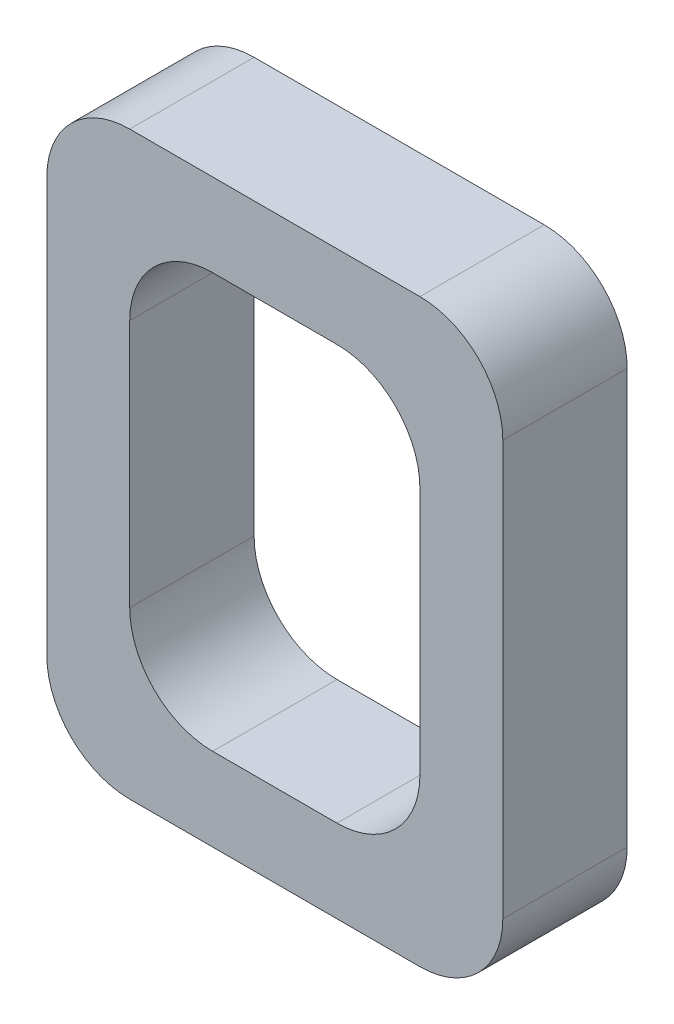
ISO-10303-21;
HEADER;
FILE_DESCRIPTION(('STEP AP214'),'2;1');
FILE_NAME('part.step','',(''),(''),'','','');
FILE_SCHEMA(('AUTOMOTIVE_DESIGN { 1 0 10303 214 1 1 1 1 }'));
ENDSEC;
DATA;
#1=APPLICATION_CONTEXT('core data for automotive mechanical design processes');
#2=APPLICATION_PROTOCOL_DEFINITION('international standard','automotive_design',2000,#1);
#3=PRODUCT_CONTEXT('',#1,'mechanical');
#4=PRODUCT('Part','Part','',(#3));
#5=PRODUCT_RELATED_PRODUCT_CATEGORY('part','',(#4));
#6=PRODUCT_DEFINITION_FORMATION('','',#4);
#7=PRODUCT_DEFINITION_CONTEXT('part definition',#1,'design');
#8=PRODUCT_DEFINITION('design','',#6,#7);
#9=PRODUCT_DEFINITION_SHAPE('','',#8);
#10=(LENGTH_UNIT() NAMED_UNIT(*) SI_UNIT(.MILLI.,.METRE.));
#11=(NAMED_UNIT(*) PLANE_ANGLE_UNIT() SI_UNIT($,.RADIAN.));
#12=(NAMED_UNIT(*) SI_UNIT($,.STERADIAN.) SOLID_ANGLE_UNIT());
#13=UNCERTAINTY_MEASURE_WITH_UNIT(LENGTH_MEASURE(1.E-05),#10,'distance_accuracy_value','');
#14=(GEOMETRIC_REPRESENTATION_CONTEXT(3) GLOBAL_UNCERTAINTY_ASSIGNED_CONTEXT((#13)) GLOBAL_UNIT_ASSIGNED_CONTEXT((#10,
#11,#12)) REPRESENTATION_CONTEXT('',''));
#15=CARTESIAN_POINT('',(0.,0.,0.));
#16=DIRECTION('',(0.,0.,1.));
#17=DIRECTION('',(1.,0.,0.));
#18=AXIS2_PLACEMENT_3D('',#15,#16,#17);
#19=CARTESIAN_POINT('',(-17.5,25.,15.));
#20=DIRECTION('',(0.,0.,1.));
#21=DIRECTION('',(1.,0.,0.));
#22=AXIS2_PLACEMENT_3D('',#19,#20,#21);
#23=PLANE('',#22);
#24=CARTESIAN_POINT('',(-17.5,25.,15.));
#25=DIRECTION('',(0.,0.,1.));
#26=DIRECTION('',(1.,0.,0.));
#27=AXIS2_PLACEMENT_3D('',#24,#25,#26);
#28=CIRCLE('',#27,10.);
#29=CARTESIAN_POINT('',(-17.4999999999999,35.,15.));
#30=VERTEX_POINT('',#29);
#31=CARTESIAN_POINT('',(-27.5,24.9999999999999,15.));
#32=VERTEX_POINT('',#31);
#33=EDGE_CURVE('E210',#30,#32,#28,.T.);
#34=ORIENTED_EDGE('',*,*,#33,.T.);
#35=DIRECTION('',(0.,-1.,0.));
#36=VECTOR('',#35,1.);
#37=CARTESIAN_POINT('',(-27.5,-24.9999999999999,15.));
#38=LINE('',#37,#36);
#39=CARTESIAN_POINT('',(-27.5,-24.9999999999999,15.));
#40=VERTEX_POINT('',#39);
#41=EDGE_CURVE('E213',#32,#40,#38,.T.);
#42=ORIENTED_EDGE('',*,*,#41,.T.);
#43=CARTESIAN_POINT('',(-17.5,-25.,15.));
#44=DIRECTION('',(0.,0.,1.));
#45=DIRECTION('',(-1.,0.,0.));
#46=AXIS2_PLACEMENT_3D('',#43,#44,#45);
#47=CIRCLE('',#46,10.);
#48=CARTESIAN_POINT('',(-17.4999999999999,-35.,15.));
#49=VERTEX_POINT('',#48);
#50=EDGE_CURVE('E216',#40,#49,#47,.T.);
#51=ORIENTED_EDGE('',*,*,#50,.T.);
#52=DIRECTION('',(1.,0.,0.));
#53=VECTOR('',#52,1.);
#54=CARTESIAN_POINT('',(-17.4999999999999,-35.,15.));
#55=LINE('',#54,#53);
#56=CARTESIAN_POINT('',(17.4999999999999,-35.,15.));
#57=VERTEX_POINT('',#56);
#58=EDGE_CURVE('E218',#49,#57,#55,.T.);
#59=ORIENTED_EDGE('',*,*,#58,.T.);
#60=CARTESIAN_POINT('',(17.5,-25.,15.));
#61=DIRECTION('',(0.,0.,1.));
#62=DIRECTION('',(1.,0.,0.));
#63=AXIS2_PLACEMENT_3D('',#60,#61,#62);
#64=CIRCLE('',#63,10.);
#65=CARTESIAN_POINT('',(27.5,-24.9999999999999,15.));
#66=VERTEX_POINT('',#65);
#67=EDGE_CURVE('E220',#57,#66,#64,.T.);
#68=ORIENTED_EDGE('',*,*,#67,.T.);
#69=DIRECTION('',(0.,1.,0.));
#70=VECTOR('',#69,1.);
#71=CARTESIAN_POINT('',(27.5,-24.9999999999999,15.));
#72=LINE('',#71,#70);
#73=CARTESIAN_POINT('',(27.5,24.9999999999999,15.));
#74=VERTEX_POINT('',#73);
#75=EDGE_CURVE('E222',#66,#74,#72,.T.);
#76=ORIENTED_EDGE('',*,*,#75,.T.);
#77=CARTESIAN_POINT('',(17.5,25.,15.));
#78=DIRECTION('',(0.,0.,1.));
#79=DIRECTION('',(1.,0.,0.));
#80=AXIS2_PLACEMENT_3D('',#77,#78,#79);
#81=CIRCLE('',#80,10.);
#82=CARTESIAN_POINT('',(17.4999999999999,35.,15.));
#83=VERTEX_POINT('',#82);
#84=EDGE_CURVE('E224',#74,#83,#81,.T.);
#85=ORIENTED_EDGE('',*,*,#84,.T.);
#86=DIRECTION('',(-1.,0.,0.));
#87=VECTOR('',#86,1.);
#88=CARTESIAN_POINT('',(-17.4999999999999,35.,15.));
#89=LINE('',#88,#87);
#90=EDGE_CURVE('E226',#83,#30,#89,.T.);
#91=ORIENTED_EDGE('',*,*,#90,.T.);
#92=EDGE_LOOP('',(#34,#42,#51,#59,#68,#76,#85,#91));
#93=FACE_BOUND('',#92,.T.);
#94=DIRECTION('',(-1.,0.,0.));
#95=VECTOR('',#94,1.);
#96=CARTESIAN_POINT('',(-7.49999999999994,25.,15.));
#97=LINE('',#96,#95);
#98=CARTESIAN_POINT('',(7.49999999999993,25.,15.));
#99=VERTEX_POINT('',#98);
#100=CARTESIAN_POINT('',(-7.49999999999994,25.,15.));
#101=VERTEX_POINT('',#100);
#102=EDGE_CURVE('E153',#99,#101,#97,.T.);
#103=ORIENTED_EDGE('',*,*,#102,.F.);
#104=CARTESIAN_POINT('',(7.5,15.,15.));
#105=DIRECTION('',(0.,0.,1.));
#106=DIRECTION('',(-1.,0.,0.));
#107=AXIS2_PLACEMENT_3D('',#104,#105,#106);
#108=CIRCLE('',#107,10.);
#109=CARTESIAN_POINT('',(17.5,14.9999999999999,15.));
#110=VERTEX_POINT('',#109);
#111=EDGE_CURVE('E145',#110,#99,#108,.T.);
#112=ORIENTED_EDGE('',*,*,#111,.F.);
#113=DIRECTION('',(0.,1.,0.));
#114=VECTOR('',#113,1.);
#115=CARTESIAN_POINT('',(17.5,-14.9999999999999,15.));
#116=LINE('',#115,#114);
#117=CARTESIAN_POINT('',(17.5,-14.9999999999999,15.));
#118=VERTEX_POINT('',#117);
#119=EDGE_CURVE('E178',#118,#110,#116,.T.);
#120=ORIENTED_EDGE('',*,*,#119,.F.);
#121=CARTESIAN_POINT('',(7.5,-15.,15.));
#122=DIRECTION('',(0.,0.,1.));
#123=DIRECTION('',(-1.,0.,0.));
#124=AXIS2_PLACEMENT_3D('',#121,#122,#123);
#125=CIRCLE('',#124,10.);
#126=CARTESIAN_POINT('',(7.49999999999993,-25.,15.));
#127=VERTEX_POINT('',#126);
#128=EDGE_CURVE('E176',#127,#118,#125,.T.);
#129=ORIENTED_EDGE('',*,*,#128,.F.);
#130=DIRECTION('',(1.,0.,0.));
#131=VECTOR('',#130,1.);
#132=CARTESIAN_POINT('',(-7.49999999999994,-25.,15.));
#133=LINE('',#132,#131);
#134=CARTESIAN_POINT('',(-7.49999999999994,-25.,15.));
#135=VERTEX_POINT('',#134);
#136=EDGE_CURVE('E174',#135,#127,#133,.T.);
#137=ORIENTED_EDGE('',*,*,#136,.F.);
#138=CARTESIAN_POINT('',(-7.50000000000001,-15.,15.));
#139=DIRECTION('',(0.,0.,1.));
#140=DIRECTION('',(1.,0.,0.));
#141=AXIS2_PLACEMENT_3D('',#138,#139,#140);
#142=CIRCLE('',#141,10.);
#143=CARTESIAN_POINT('',(-17.5,-14.9999999999999,15.));
#144=VERTEX_POINT('',#143);
#145=EDGE_CURVE('E172',#144,#135,#142,.T.);
#146=ORIENTED_EDGE('',*,*,#145,.F.);
#147=DIRECTION('',(0.,-1.,0.));
#148=VECTOR('',#147,1.);
#149=CARTESIAN_POINT('',(-17.5,-14.9999999999999,15.));
#150=LINE('',#149,#148);
#151=CARTESIAN_POINT('',(-17.5,14.9999999999999,15.));
#152=VERTEX_POINT('',#151);
#153=EDGE_CURVE('E168',#152,#144,#150,.T.);
#154=ORIENTED_EDGE('',*,*,#153,.F.);
#155=CARTESIAN_POINT('',(-7.50000000000001,15.,15.));
#156=DIRECTION('',(0.,0.,1.));
#157=DIRECTION('',(-1.,0.,0.));
#158=AXIS2_PLACEMENT_3D('',#155,#156,#157);
#159=CIRCLE('',#158,10.);
#160=EDGE_CURVE('E166',#101,#152,#159,.T.);
#161=ORIENTED_EDGE('',*,*,#160,.F.);
#162=EDGE_LOOP('',(#103,#112,#120,#129,#137,#146,#154,#161));
#163=FACE_BOUND('',#162,.T.);
#164=ADVANCED_FACE('F32',(#93,#163),#23,.T.);
#165=CARTESIAN_POINT('',(-17.5,25.,0.));
#166=DIRECTION('',(0.,0.,1.));
#167=DIRECTION('',(1.,0.,0.));
#168=AXIS2_PLACEMENT_3D('',#165,#166,#167);
#169=PLANE('',#168);
#170=CARTESIAN_POINT('',(-17.5,25.,0.));
#171=DIRECTION('',(0.,0.,1.));
#172=DIRECTION('',(1.,0.,0.));
#173=AXIS2_PLACEMENT_3D('',#170,#171,#172);
#174=CIRCLE('',#173,10.);
#175=CARTESIAN_POINT('',(-17.4999999999999,35.,0.));
#176=VERTEX_POINT('',#175);
#177=CARTESIAN_POINT('',(-27.5,24.9999999999999,0.));
#178=VERTEX_POINT('',#177);
#179=EDGE_CURVE('E161',#176,#178,#174,.T.);
#180=ORIENTED_EDGE('',*,*,#179,.F.);
#181=DIRECTION('',(-1.,0.,0.));
#182=VECTOR('',#181,1.);
#183=CARTESIAN_POINT('',(-17.4999999999999,35.,0.));
#184=LINE('',#183,#182);
#185=CARTESIAN_POINT('',(17.4999999999999,35.,0.));
#186=VERTEX_POINT('',#185);
#187=EDGE_CURVE('E214',#186,#176,#184,.T.);
#188=ORIENTED_EDGE('',*,*,#187,.F.);
#189=CARTESIAN_POINT('',(17.5,25.,0.));
#190=DIRECTION('',(0.,0.,1.));
#191=DIRECTION('',(1.,0.,0.));
#192=AXIS2_PLACEMENT_3D('',#189,#190,#191);
#193=CIRCLE('',#192,10.);
#194=CARTESIAN_POINT('',(27.5,24.9999999999999,0.));
#195=VERTEX_POINT('',#194);
#196=EDGE_CURVE('E241',#195,#186,#193,.T.);
#197=ORIENTED_EDGE('',*,*,#196,.F.);
#198=DIRECTION('',(0.,1.,0.));
#199=VECTOR('',#198,1.);
#200=CARTESIAN_POINT('',(27.5,-24.9999999999999,0.));
#201=LINE('',#200,#199);
#202=CARTESIAN_POINT('',(27.5,-24.9999999999999,0.));
#203=VERTEX_POINT('',#202);
#204=EDGE_CURVE('E239',#203,#195,#201,.T.);
#205=ORIENTED_EDGE('',*,*,#204,.F.);
#206=CARTESIAN_POINT('',(17.5,-25.,0.));
#207=DIRECTION('',(0.,0.,1.));
#208=DIRECTION('',(1.,0.,0.));
#209=AXIS2_PLACEMENT_3D('',#206,#207,#208);
#210=CIRCLE('',#209,10.);
#211=CARTESIAN_POINT('',(17.4999999999999,-35.,0.));
#212=VERTEX_POINT('',#211);
#213=EDGE_CURVE('E237',#212,#203,#210,.T.);
#214=ORIENTED_EDGE('',*,*,#213,.F.);
#215=DIRECTION('',(1.,0.,0.));
#216=VECTOR('',#215,1.);
#217=CARTESIAN_POINT('',(-17.4999999999999,-35.,0.));
#218=LINE('',#217,#216);
#219=CARTESIAN_POINT('',(-17.4999999999999,-35.,0.));
#220=VERTEX_POINT('',#219);
#221=EDGE_CURVE('E235',#220,#212,#218,.T.);
#222=ORIENTED_EDGE('',*,*,#221,.F.);
#223=CARTESIAN_POINT('',(-17.5,-25.,0.));
#224=DIRECTION('',(0.,0.,1.));
#225=DIRECTION('',(-1.,0.,0.));
#226=AXIS2_PLACEMENT_3D('',#223,#224,#225);
#227=CIRCLE('',#226,10.);
#228=CARTESIAN_POINT('',(-27.5,-24.9999999999999,0.));
#229=VERTEX_POINT('',#228);
#230=EDGE_CURVE('E233',#229,#220,#227,.T.);
#231=ORIENTED_EDGE('',*,*,#230,.F.);
#232=DIRECTION('',(0.,-1.,0.));
#233=VECTOR('',#232,1.);
#234=CARTESIAN_POINT('',(-27.5,-24.9999999999999,0.));
#235=LINE('',#234,#233);
#236=EDGE_CURVE('E231',#178,#229,#235,.T.);
#237=ORIENTED_EDGE('',*,*,#236,.F.);
#238=EDGE_LOOP('',(#180,#188,#197,#205,#214,#222,#231,#237));
#239=FACE_BOUND('',#238,.T.);
#240=CARTESIAN_POINT('',(7.5,15.,0.));
#241=DIRECTION('',(0.,0.,1.));
#242=DIRECTION('',(-1.,0.,0.));
#243=AXIS2_PLACEMENT_3D('',#240,#241,#242);
#244=CIRCLE('',#243,10.);
#245=CARTESIAN_POINT('',(17.5,14.9999999999999,0.));
#246=VERTEX_POINT('',#245);
#247=CARTESIAN_POINT('',(7.49999999999993,25.,0.));
#248=VERTEX_POINT('',#247);
#249=EDGE_CURVE('E55',#246,#248,#244,.T.);
#250=ORIENTED_EDGE('',*,*,#249,.T.);
#251=DIRECTION('',(-1.,0.,0.));
#252=VECTOR('',#251,1.);
#253=CARTESIAN_POINT('',(-7.49999999999994,25.,0.));
#254=LINE('',#253,#252);
#255=CARTESIAN_POINT('',(-7.49999999999994,25.,0.));
#256=VERTEX_POINT('',#255);
#257=EDGE_CURVE('E160',#248,#256,#254,.T.);
#258=ORIENTED_EDGE('',*,*,#257,.T.);
#259=CARTESIAN_POINT('',(-7.50000000000001,15.,0.));
#260=DIRECTION('',(0.,0.,1.));
#261=DIRECTION('',(-1.,0.,0.));
#262=AXIS2_PLACEMENT_3D('',#259,#260,#261);
#263=CIRCLE('',#262,10.);
#264=CARTESIAN_POINT('',(-17.5,14.9999999999999,0.));
#265=VERTEX_POINT('',#264);
#266=EDGE_CURVE('E182',#256,#265,#263,.T.);
#267=ORIENTED_EDGE('',*,*,#266,.T.);
#268=DIRECTION('',(0.,-1.,0.));
#269=VECTOR('',#268,1.);
#270=CARTESIAN_POINT('',(-17.5,-14.9999999999999,0.));
#271=LINE('',#270,#269);
#272=CARTESIAN_POINT('',(-17.5,-14.9999999999999,0.));
#273=VERTEX_POINT('',#272);
#274=EDGE_CURVE('E185',#265,#273,#271,.T.);
#275=ORIENTED_EDGE('',*,*,#274,.T.);
#276=CARTESIAN_POINT('',(-7.50000000000001,-15.,0.));
#277=DIRECTION('',(0.,0.,1.));
#278=DIRECTION('',(1.,0.,0.));
#279=AXIS2_PLACEMENT_3D('',#276,#277,#278);
#280=CIRCLE('',#279,10.);
#281=CARTESIAN_POINT('',(-7.49999999999994,-25.,0.));
#282=VERTEX_POINT('',#281);
#283=EDGE_CURVE('E188',#273,#282,#280,.T.);
#284=ORIENTED_EDGE('',*,*,#283,.T.);
#285=DIRECTION('',(1.,0.,0.));
#286=VECTOR('',#285,1.);
#287=CARTESIAN_POINT('',(-7.49999999999994,-25.,0.));
#288=LINE('',#287,#286);
#289=CARTESIAN_POINT('',(7.49999999999993,-25.,0.));
#290=VERTEX_POINT('',#289);
#291=EDGE_CURVE('E191',#282,#290,#288,.T.);
#292=ORIENTED_EDGE('',*,*,#291,.T.);
#293=CARTESIAN_POINT('',(7.5,-15.,0.));
#294=DIRECTION('',(0.,0.,1.));
#295=DIRECTION('',(-1.,0.,0.));
#296=AXIS2_PLACEMENT_3D('',#293,#294,#295);
#297=CIRCLE('',#296,10.);
#298=CARTESIAN_POINT('',(17.5,-14.9999999999999,0.));
#299=VERTEX_POINT('',#298);
#300=EDGE_CURVE('E194',#290,#299,#297,.T.);
#301=ORIENTED_EDGE('',*,*,#300,.T.);
#302=DIRECTION('',(0.,1.,0.));
#303=VECTOR('',#302,1.);
#304=CARTESIAN_POINT('',(17.5,-14.9999999999999,0.));
#305=LINE('',#304,#303);
#306=EDGE_CURVE('E154',#299,#246,#305,.T.);
#307=ORIENTED_EDGE('',*,*,#306,.T.);
#308=EDGE_LOOP('',(#250,#258,#267,#275,#284,#292,#301,#307));
#309=FACE_BOUND('',#308,.T.);
#310=ADVANCED_FACE('F271',(#239,#309),#169,.F.);
#311=CARTESIAN_POINT('',(-17.5,25.,15.));
#312=DIRECTION('',(0.,0.,-1.));
#313=DIRECTION('',(-1.,0.,0.));
#314=AXIS2_PLACEMENT_3D('',#311,#312,#313);
#315=CYLINDRICAL_SURFACE('',#314,10.);
#316=ORIENTED_EDGE('',*,*,#179,.T.);
#317=DIRECTION('',(0.,0.,-1.));
#318=VECTOR('',#317,1.);
#319=CARTESIAN_POINT('',(-27.5,24.9999999999999,15.));
#320=LINE('',#319,#318);
#321=EDGE_CURVE('E11',#32,#178,#320,.T.);
#322=ORIENTED_EDGE('',*,*,#321,.F.);
#323=ORIENTED_EDGE('',*,*,#33,.F.);
#324=DIRECTION('',(0.,0.,-1.));
#325=VECTOR('',#324,1.);
#326=CARTESIAN_POINT('',(-17.4999999999999,35.,15.));
#327=LINE('',#326,#325);
#328=EDGE_CURVE('E228',#30,#176,#327,.T.);
#329=ORIENTED_EDGE('',*,*,#328,.T.);
#330=EDGE_LOOP('',(#316,#322,#323,#329));
#331=FACE_BOUND('',#330,.T.);
#332=ADVANCED_FACE('F34',(#331),#315,.T.);
#333=CARTESIAN_POINT('',(-27.5,-24.9999999999999,15.));
#334=DIRECTION('',(1.,0.,0.));
#335=DIRECTION('',(0.,0.,-1.));
#336=AXIS2_PLACEMENT_3D('',#333,#334,#335);
#337=PLANE('',#336);
#338=ORIENTED_EDGE('',*,*,#236,.T.);
#339=DIRECTION('',(0.,0.,-1.));
#340=VECTOR('',#339,1.);
#341=CARTESIAN_POINT('',(-27.5,-24.9999999999999,15.));
#342=LINE('',#341,#340);
#343=EDGE_CURVE('E40',#40,#229,#342,.T.);
#344=ORIENTED_EDGE('',*,*,#343,.F.);
#345=ORIENTED_EDGE('',*,*,#41,.F.);
#346=ORIENTED_EDGE('',*,*,#321,.T.);
#347=EDGE_LOOP('',(#338,#344,#345,#346));
#348=FACE_BOUND('',#347,.T.);
#349=ADVANCED_FACE('F288',(#348),#337,.F.);
#350=CARTESIAN_POINT('',(-17.5,-25.,15.));
#351=DIRECTION('',(0.,0.,-1.));
#352=DIRECTION('',(-1.,0.,0.));
#353=AXIS2_PLACEMENT_3D('',#350,#351,#352);
#354=CYLINDRICAL_SURFACE('',#353,10.);
#355=ORIENTED_EDGE('',*,*,#230,.T.);
#356=DIRECTION('',(0.,0.,-1.));
#357=VECTOR('',#356,1.);
#358=CARTESIAN_POINT('',(-17.4999999999999,-35.,15.));
#359=LINE('',#358,#357);
#360=EDGE_CURVE('E258',#49,#220,#359,.T.);
#361=ORIENTED_EDGE('',*,*,#360,.F.);
#362=ORIENTED_EDGE('',*,*,#50,.F.);
#363=ORIENTED_EDGE('',*,*,#343,.T.);
#364=EDGE_LOOP('',(#355,#361,#362,#363));
#365=FACE_BOUND('',#364,.T.);
#366=ADVANCED_FACE('F265',(#365),#354,.T.);
#367=CARTESIAN_POINT('',(-17.4999999999999,-35.,15.));
#368=DIRECTION('',(0.,1.,0.));
#369=DIRECTION('',(0.,0.,1.));
#370=AXIS2_PLACEMENT_3D('',#367,#368,#369);
#371=PLANE('',#370);
#372=ORIENTED_EDGE('',*,*,#221,.T.);
#373=DIRECTION('',(0.,0.,-1.));
#374=VECTOR('',#373,1.);
#375=CARTESIAN_POINT('',(17.4999999999999,-35.,15.));
#376=LINE('',#375,#374);
#377=EDGE_CURVE('E255',#57,#212,#376,.T.);
#378=ORIENTED_EDGE('',*,*,#377,.F.);
#379=ORIENTED_EDGE('',*,*,#58,.F.);
#380=ORIENTED_EDGE('',*,*,#360,.T.);
#381=EDGE_LOOP('',(#372,#378,#379,#380));
#382=FACE_BOUND('',#381,.T.);
#383=ADVANCED_FACE('F277',(#382),#371,.F.);
#384=CARTESIAN_POINT('',(17.5,-25.,15.));
#385=DIRECTION('',(0.,0.,-1.));
#386=DIRECTION('',(-1.,0.,0.));
#387=AXIS2_PLACEMENT_3D('',#384,#385,#386);
#388=CYLINDRICAL_SURFACE('',#387,10.);
#389=ORIENTED_EDGE('',*,*,#213,.T.);
#390=DIRECTION('',(0.,0.,-1.));
#391=VECTOR('',#390,1.);
#392=CARTESIAN_POINT('',(27.5,-24.9999999999999,15.));
#393=LINE('',#392,#391);
#394=EDGE_CURVE('E252',#66,#203,#393,.T.);
#395=ORIENTED_EDGE('',*,*,#394,.F.);
#396=ORIENTED_EDGE('',*,*,#67,.F.);
#397=ORIENTED_EDGE('',*,*,#377,.T.);
#398=EDGE_LOOP('',(#389,#395,#396,#397));
#399=FACE_BOUND('',#398,.T.);
#400=ADVANCED_FACE('F281',(#399),#388,.T.);
#401=CARTESIAN_POINT('',(27.5,-24.9999999999999,15.));
#402=DIRECTION('',(-1.,0.,0.));
#403=DIRECTION('',(0.,-1.,0.));
#404=AXIS2_PLACEMENT_3D('',#401,#402,#403);
#405=PLANE('',#404);
#406=ORIENTED_EDGE('',*,*,#204,.T.);
#407=DIRECTION('',(0.,0.,-1.));
#408=VECTOR('',#407,1.);
#409=CARTESIAN_POINT('',(27.5,24.9999999999999,15.));
#410=LINE('',#409,#408);
#411=EDGE_CURVE('E249',#74,#195,#410,.T.);
#412=ORIENTED_EDGE('',*,*,#411,.F.);
#413=ORIENTED_EDGE('',*,*,#75,.F.);
#414=ORIENTED_EDGE('',*,*,#394,.T.);
#415=EDGE_LOOP('',(#406,#412,#413,#414));
#416=FACE_BOUND('',#415,.T.);
#417=ADVANCED_FACE('F301',(#416),#405,.F.);
#418=CARTESIAN_POINT('',(17.5,25.,15.));
#419=DIRECTION('',(0.,0.,-1.));
#420=DIRECTION('',(-1.,0.,0.));
#421=AXIS2_PLACEMENT_3D('',#418,#419,#420);
#422=CYLINDRICAL_SURFACE('',#421,10.);
#423=ORIENTED_EDGE('',*,*,#196,.T.);
#424=DIRECTION('',(0.,0.,-1.));
#425=VECTOR('',#424,1.);
#426=CARTESIAN_POINT('',(17.4999999999999,35.,15.));
#427=LINE('',#426,#425);
#428=EDGE_CURVE('E246',#83,#186,#427,.T.);
#429=ORIENTED_EDGE('',*,*,#428,.F.);
#430=ORIENTED_EDGE('',*,*,#84,.F.);
#431=ORIENTED_EDGE('',*,*,#411,.T.);
#432=EDGE_LOOP('',(#423,#429,#430,#431));
#433=FACE_BOUND('',#432,.T.);
#434=ADVANCED_FACE('F299',(#433),#422,.T.);
#435=CARTESIAN_POINT('',(-17.4999999999999,35.,15.));
#436=DIRECTION('',(0.,-1.,0.));
#437=DIRECTION('',(0.,0.,-1.));
#438=AXIS2_PLACEMENT_3D('',#435,#436,#437);
#439=PLANE('',#438);
#440=ORIENTED_EDGE('',*,*,#187,.T.);
#441=ORIENTED_EDGE('',*,*,#328,.F.);
#442=ORIENTED_EDGE('',*,*,#90,.F.);
#443=ORIENTED_EDGE('',*,*,#428,.T.);
#444=EDGE_LOOP('',(#440,#441,#442,#443));
#445=FACE_BOUND('',#444,.T.);
#446=ADVANCED_FACE('F294',(#445),#439,.F.);
#447=CARTESIAN_POINT('',(7.5,15.,15.));
#448=DIRECTION('',(0.,0.,-1.));
#449=DIRECTION('',(-1.,0.,0.));
#450=AXIS2_PLACEMENT_3D('',#447,#448,#449);
#451=CYLINDRICAL_SURFACE('',#450,10.);
#452=ORIENTED_EDGE('',*,*,#249,.F.);
#453=DIRECTION('',(0.,0.,-1.));
#454=VECTOR('',#453,1.);
#455=CARTESIAN_POINT('',(17.5,14.9999999999999,15.));
#456=LINE('',#455,#454);
#457=EDGE_CURVE('E149',#110,#246,#456,.T.);
#458=ORIENTED_EDGE('',*,*,#457,.F.);
#459=ORIENTED_EDGE('',*,*,#111,.T.);
#460=DIRECTION('',(0.,0.,-1.));
#461=VECTOR('',#460,1.);
#462=CARTESIAN_POINT('',(7.49999999999993,25.,15.));
#463=LINE('',#462,#461);
#464=EDGE_CURVE('E148',#99,#248,#463,.T.);
#465=ORIENTED_EDGE('',*,*,#464,.T.);
#466=EDGE_LOOP('',(#452,#458,#459,#465));
#467=FACE_BOUND('',#466,.T.);
#468=ADVANCED_FACE('F147',(#467),#451,.F.);
#469=CARTESIAN_POINT('',(-7.49999999999994,25.,15.));
#470=DIRECTION('',(0.,-1.,0.));
#471=DIRECTION('',(0.,0.,-1.));
#472=AXIS2_PLACEMENT_3D('',#469,#470,#471);
#473=PLANE('',#472);
#474=ORIENTED_EDGE('',*,*,#257,.F.);
#475=ORIENTED_EDGE('',*,*,#464,.F.);
#476=ORIENTED_EDGE('',*,*,#102,.T.);
#477=DIRECTION('',(0.,0.,-1.));
#478=VECTOR('',#477,1.);
#479=CARTESIAN_POINT('',(-7.49999999999994,25.,15.));
#480=LINE('',#479,#478);
#481=EDGE_CURVE('E162',#101,#256,#480,.T.);
#482=ORIENTED_EDGE('',*,*,#481,.T.);
#483=EDGE_LOOP('',(#474,#475,#476,#482));
#484=FACE_BOUND('',#483,.T.);
#485=ADVANCED_FACE('F157',(#484),#473,.T.);
#486=CARTESIAN_POINT('',(-7.50000000000001,15.,15.));
#487=DIRECTION('',(0.,0.,-1.));
#488=DIRECTION('',(-1.,0.,0.));
#489=AXIS2_PLACEMENT_3D('',#486,#487,#488);
#490=CYLINDRICAL_SURFACE('',#489,10.);
#491=ORIENTED_EDGE('',*,*,#266,.F.);
#492=ORIENTED_EDGE('',*,*,#481,.F.);
#493=ORIENTED_EDGE('',*,*,#160,.T.);
#494=DIRECTION('',(0.,0.,-1.));
#495=VECTOR('',#494,1.);
#496=CARTESIAN_POINT('',(-17.5,14.9999999999999,15.));
#497=LINE('',#496,#495);
#498=EDGE_CURVE('E207',#152,#265,#497,.T.);
#499=ORIENTED_EDGE('',*,*,#498,.T.);
#500=EDGE_LOOP('',(#491,#492,#493,#499));
#501=FACE_BOUND('',#500,.T.);
#502=ADVANCED_FACE('F326',(#501),#490,.F.);
#503=CARTESIAN_POINT('',(-17.5,-14.9999999999999,15.));
#504=DIRECTION('',(1.,0.,0.));
#505=DIRECTION('',(0.,0.,-1.));
#506=AXIS2_PLACEMENT_3D('',#503,#504,#505);
#507=PLANE('',#506);
#508=ORIENTED_EDGE('',*,*,#274,.F.);
#509=ORIENTED_EDGE('',*,*,#498,.F.);
#510=ORIENTED_EDGE('',*,*,#153,.T.);
#511=DIRECTION('',(0.,0.,-1.));
#512=VECTOR('',#511,1.);
#513=CARTESIAN_POINT('',(-17.5,-14.9999999999999,15.));
#514=LINE('',#513,#512);
#515=EDGE_CURVE('E205',#144,#273,#514,.T.);
#516=ORIENTED_EDGE('',*,*,#515,.T.);
#517=EDGE_LOOP('',(#508,#509,#510,#516));
#518=FACE_BOUND('',#517,.T.);
#519=ADVANCED_FACE('F330',(#518),#507,.T.);
#520=CARTESIAN_POINT('',(-7.50000000000001,-15.,15.));
#521=DIRECTION('',(0.,0.,-1.));
#522=DIRECTION('',(-1.,0.,0.));
#523=AXIS2_PLACEMENT_3D('',#520,#521,#522);
#524=CYLINDRICAL_SURFACE('',#523,10.);
#525=ORIENTED_EDGE('',*,*,#283,.F.);
#526=ORIENTED_EDGE('',*,*,#515,.F.);
#527=ORIENTED_EDGE('',*,*,#145,.T.);
#528=DIRECTION('',(0.,0.,-1.));
#529=VECTOR('',#528,1.);
#530=CARTESIAN_POINT('',(-7.49999999999994,-25.,15.));
#531=LINE('',#530,#529);
#532=EDGE_CURVE('E203',#135,#282,#531,.T.);
#533=ORIENTED_EDGE('',*,*,#532,.T.);
#534=EDGE_LOOP('',(#525,#526,#527,#533));
#535=FACE_BOUND('',#534,.T.);
#536=ADVANCED_FACE('F336',(#535),#524,.F.);
#537=CARTESIAN_POINT('',(-7.49999999999994,-25.,15.));
#538=DIRECTION('',(0.,1.,0.));
#539=DIRECTION('',(0.,0.,1.));
#540=AXIS2_PLACEMENT_3D('',#537,#538,#539);
#541=PLANE('',#540);
#542=ORIENTED_EDGE('',*,*,#291,.F.);
#543=ORIENTED_EDGE('',*,*,#532,.F.);
#544=ORIENTED_EDGE('',*,*,#136,.T.);
#545=DIRECTION('',(0.,0.,-1.));
#546=VECTOR('',#545,1.);
#547=CARTESIAN_POINT('',(7.49999999999993,-25.,15.));
#548=LINE('',#547,#546);
#549=EDGE_CURVE('E201',#127,#290,#548,.T.);
#550=ORIENTED_EDGE('',*,*,#549,.T.);
#551=EDGE_LOOP('',(#542,#543,#544,#550));
#552=FACE_BOUND('',#551,.T.);
#553=ADVANCED_FACE('F340',(#552),#541,.T.);
#554=CARTESIAN_POINT('',(7.5,-15.,15.));
#555=DIRECTION('',(0.,0.,-1.));
#556=DIRECTION('',(-1.,0.,0.));
#557=AXIS2_PLACEMENT_3D('',#554,#555,#556);
#558=CYLINDRICAL_SURFACE('',#557,10.);
#559=ORIENTED_EDGE('',*,*,#300,.F.);
#560=ORIENTED_EDGE('',*,*,#549,.F.);
#561=ORIENTED_EDGE('',*,*,#128,.T.);
#562=DIRECTION('',(0.,0.,-1.));
#563=VECTOR('',#562,1.);
#564=CARTESIAN_POINT('',(17.5,-14.9999999999999,15.));
#565=LINE('',#564,#563);
#566=EDGE_CURVE('E47',#118,#299,#565,.T.);
#567=ORIENTED_EDGE('',*,*,#566,.T.);
#568=EDGE_LOOP('',(#559,#560,#561,#567));
#569=FACE_BOUND('',#568,.T.);
#570=ADVANCED_FACE('F344',(#569),#558,.F.);
#571=CARTESIAN_POINT('',(17.5,-14.9999999999999,15.));
#572=DIRECTION('',(-1.,0.,0.));
#573=DIRECTION('',(0.,0.,1.));
#574=AXIS2_PLACEMENT_3D('',#571,#572,#573);
#575=PLANE('',#574);
#576=ORIENTED_EDGE('',*,*,#306,.F.);
#577=ORIENTED_EDGE('',*,*,#566,.F.);
#578=ORIENTED_EDGE('',*,*,#119,.T.);
#579=ORIENTED_EDGE('',*,*,#457,.T.);
#580=EDGE_LOOP('',(#576,#577,#578,#579));
#581=FACE_BOUND('',#580,.T.);
#582=ADVANCED_FACE('F348',(#581),#575,.T.);
#583=CLOSED_SHELL('',(#164,#310,#332,#349,#366,#383,#400,#417,#434,#446,#468,#485,#502,#519,
#536,#553,#570,#582));
#584=MANIFOLD_SOLID_BREP('B2',#583);
#585=ADVANCED_BREP_SHAPE_REPRESENTATION('',(#18,#584),#14);
#586=SHAPE_DEFINITION_REPRESENTATION(#9,#585);
ENDSEC;
END-ISO-10303-21;
